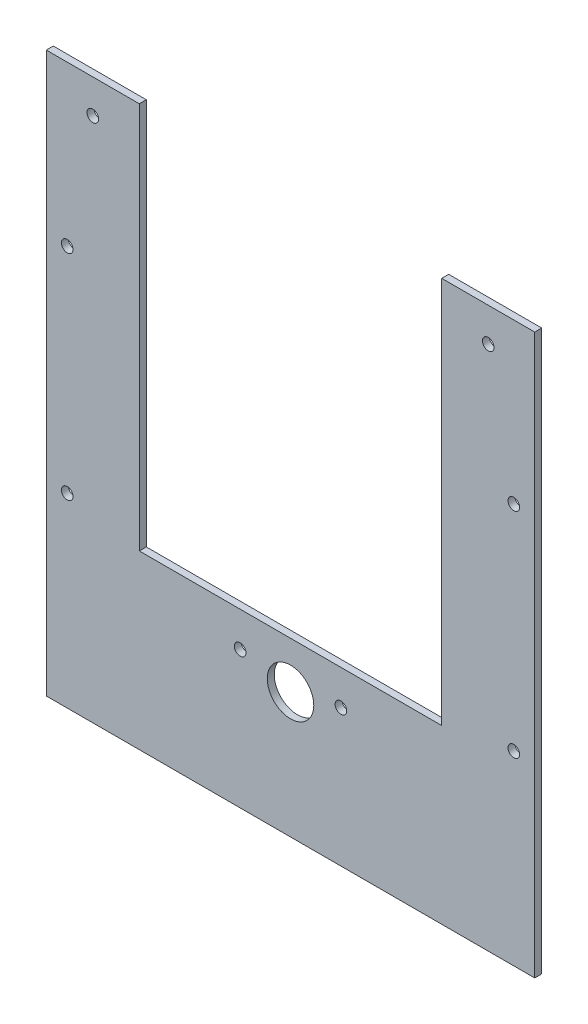
ISO-10303-21;
HEADER;
FILE_DESCRIPTION(('STEP AP214'),'2;1');
FILE_NAME('part.step','',(''),(''),'','','');
FILE_SCHEMA(('AUTOMOTIVE_DESIGN { 1 0 10303 214 1 1 1 1 }'));
ENDSEC;
DATA;
#1=APPLICATION_CONTEXT('core data for automotive mechanical design processes');
#2=APPLICATION_PROTOCOL_DEFINITION('international standard','automotive_design',2000,#1);
#3=PRODUCT_CONTEXT('',#1,'mechanical');
#4=PRODUCT('Part','Part','',(#3));
#5=PRODUCT_RELATED_PRODUCT_CATEGORY('part','',(#4));
#6=PRODUCT_DEFINITION_FORMATION('','',#4);
#7=PRODUCT_DEFINITION_CONTEXT('part definition',#1,'design');
#8=PRODUCT_DEFINITION('design','',#6,#7);
#9=PRODUCT_DEFINITION_SHAPE('','',#8);
#10=(LENGTH_UNIT() NAMED_UNIT(*) SI_UNIT(.MILLI.,.METRE.));
#11=(NAMED_UNIT(*) PLANE_ANGLE_UNIT() SI_UNIT($,.RADIAN.));
#12=(NAMED_UNIT(*) SI_UNIT($,.STERADIAN.) SOLID_ANGLE_UNIT());
#13=UNCERTAINTY_MEASURE_WITH_UNIT(LENGTH_MEASURE(1.E-05),#10,'distance_accuracy_value','');
#14=(GEOMETRIC_REPRESENTATION_CONTEXT(3) GLOBAL_UNCERTAINTY_ASSIGNED_CONTEXT((#13)) GLOBAL_UNIT_ASSIGNED_CONTEXT((#10,
#11,#12)) REPRESENTATION_CONTEXT('',''));
#15=CARTESIAN_POINT('',(0.,0.,0.));
#16=DIRECTION('',(0.,0.,1.));
#17=DIRECTION('',(1.,0.,0.));
#18=AXIS2_PLACEMENT_3D('',#15,#16,#17);
#19=CARTESIAN_POINT('',(0.,0.,3.));
#20=DIRECTION('',(0.,0.,1.));
#21=DIRECTION('',(1.,0.,0.));
#22=AXIS2_PLACEMENT_3D('',#19,#20,#21);
#23=PLANE('',#22);
#24=CARTESIAN_POINT('',(7.16828157057534,762.628389677579,3.));
#25=DIRECTION('',(0.,0.,1.));
#26=DIRECTION('',(1.,0.,0.));
#27=AXIS2_PLACEMENT_3D('',#24,#25,#26);
#28=CIRCLE('',#27,2.5);
#29=CARTESIAN_POINT('',(9.66828157057534,762.628389677579,3.));
#30=VERTEX_POINT('',#29);
#31=EDGE_CURVE('E218',#30,#30,#28,.T.);
#32=ORIENTED_EDGE('',*,*,#31,.F.);
#33=EDGE_LOOP('',(#32));
#34=FACE_BOUND('',#33,.T.);
#35=CARTESIAN_POINT('',(-110.498385096091,875.618389677579,3.));
#36=DIRECTION('',(0.,0.,1.));
#37=DIRECTION('',(1.,0.,0.));
#38=AXIS2_PLACEMENT_3D('',#35,#36,#37);
#39=CIRCLE('',#38,2.5);
#40=CARTESIAN_POINT('',(-107.998385096091,875.618389677579,3.));
#41=VERTEX_POINT('',#40);
#42=EDGE_CURVE('E206',#41,#41,#39,.T.);
#43=ORIENTED_EDGE('',*,*,#42,.F.);
#44=EDGE_LOOP('',(#43));
#45=FACE_BOUND('',#44,.T.);
#46=CARTESIAN_POINT('',(-36.165051762758,762.628389677579,3.));
#47=DIRECTION('',(0.,0.,1.));
#48=DIRECTION('',(1.,0.,0.));
#49=AXIS2_PLACEMENT_3D('',#46,#47,#48);
#50=CIRCLE('',#49,2.5);
#51=CARTESIAN_POINT('',(-33.665051762758,762.628389677579,3.));
#52=VERTEX_POINT('',#51);
#53=EDGE_CURVE('E194',#52,#52,#50,.T.);
#54=ORIENTED_EDGE('',*,*,#53,.F.);
#55=EDGE_LOOP('',(#54));
#56=FACE_BOUND('',#55,.T.);
#57=CARTESIAN_POINT('',(81.5016149039087,875.618389677579,3.));
#58=DIRECTION('',(0.,0.,1.));
#59=DIRECTION('',(1.,0.,0.));
#60=AXIS2_PLACEMENT_3D('',#57,#58,#59);
#61=CIRCLE('',#60,2.50000000000004);
#62=CARTESIAN_POINT('',(84.0016149039087,875.618389677579,3.));
#63=VERTEX_POINT('',#62);
#64=EDGE_CURVE('E182',#63,#63,#61,.T.);
#65=ORIENTED_EDGE('',*,*,#64,.F.);
#66=EDGE_LOOP('',(#65));
#67=FACE_BOUND('',#66,.T.);
#68=DIRECTION('',(0.,1.,0.));
#69=VECTOR('',#68,1.);
#70=CARTESIAN_POINT('',(90.5016149039087,703.628389677579,3.));
#71=LINE('',#70,#69);
#72=CARTESIAN_POINT('',(90.5016149039087,703.628389677579,3.));
#73=VERTEX_POINT('',#72);
#74=CARTESIAN_POINT('',(90.5016149039087,944.128389677579,3.));
#75=VERTEX_POINT('',#74);
#76=EDGE_CURVE('E145',#73,#75,#71,.T.);
#77=ORIENTED_EDGE('',*,*,#76,.T.);
#78=DIRECTION('',(-1.,0.,0.));
#79=VECTOR('',#78,1.);
#80=CARTESIAN_POINT('',(90.5016149039087,944.128389677579,3.));
#81=LINE('',#80,#79);
#82=CARTESIAN_POINT('',(50.5016149039087,944.128389677579,3.));
#83=VERTEX_POINT('',#82);
#84=EDGE_CURVE('E93',#75,#83,#81,.T.);
#85=ORIENTED_EDGE('',*,*,#84,.T.);
#86=DIRECTION('',(0.,-1.,0.));
#87=VECTOR('',#86,1.);
#88=CARTESIAN_POINT('',(50.5016149039087,777.628389677579,3.));
#89=LINE('',#88,#87);
#90=CARTESIAN_POINT('',(50.5016149039087,777.628389677579,3.));
#91=VERTEX_POINT('',#90);
#92=EDGE_CURVE('E160',#83,#91,#89,.T.);
#93=ORIENTED_EDGE('',*,*,#92,.T.);
#94=DIRECTION('',(-1.,0.,0.));
#95=VECTOR('',#94,1.);
#96=CARTESIAN_POINT('',(-79.4983850960913,777.628389677579,3.));
#97=LINE('',#96,#95);
#98=CARTESIAN_POINT('',(-79.4983850960913,777.628389677579,3.));
#99=VERTEX_POINT('',#98);
#100=EDGE_CURVE('E173',#91,#99,#97,.T.);
#101=ORIENTED_EDGE('',*,*,#100,.T.);
#102=DIRECTION('',(0.,1.,0.));
#103=VECTOR('',#102,1.);
#104=CARTESIAN_POINT('',(-79.4983850960913,944.128389677579,3.));
#105=LINE('',#104,#103);
#106=CARTESIAN_POINT('',(-79.4983850960913,944.128389677579,3.));
#107=VERTEX_POINT('',#106);
#108=EDGE_CURVE('E112',#99,#107,#105,.T.);
#109=ORIENTED_EDGE('',*,*,#108,.T.);
#110=DIRECTION('',(-1.,0.,0.));
#111=VECTOR('',#110,1.);
#112=CARTESIAN_POINT('',(-79.4983850960913,944.128389677579,3.));
#113=LINE('',#112,#111);
#114=CARTESIAN_POINT('',(-119.498385096091,944.128389677579,3.));
#115=VERTEX_POINT('',#114);
#116=EDGE_CURVE('E106',#107,#115,#113,.T.);
#117=ORIENTED_EDGE('',*,*,#116,.T.);
#118=DIRECTION('',(0.,-1.,0.));
#119=VECTOR('',#118,1.);
#120=CARTESIAN_POINT('',(-119.498385096091,703.628389677579,3.));
#121=LINE('',#120,#119);
#122=CARTESIAN_POINT('',(-119.498385096091,703.628389677579,3.));
#123=VERTEX_POINT('',#122);
#124=EDGE_CURVE('E110',#115,#123,#121,.T.);
#125=ORIENTED_EDGE('',*,*,#124,.T.);
#126=DIRECTION('',(1.,0.,0.));
#127=VECTOR('',#126,1.);
#128=CARTESIAN_POINT('',(90.5016149039087,703.628389677579,3.));
#129=LINE('',#128,#127);
#130=EDGE_CURVE('E50',#123,#73,#129,.T.);
#131=ORIENTED_EDGE('',*,*,#130,.T.);
#132=EDGE_LOOP('',(#77,#85,#93,#101,#109,#117,#125,#131));
#133=FACE_BOUND('',#132,.T.);
#134=CARTESIAN_POINT('',(70.5016149039087,929.628389677579,3.));
#135=DIRECTION('',(0.,0.,1.));
#136=DIRECTION('',(1.,0.,0.));
#137=AXIS2_PLACEMENT_3D('',#134,#135,#136);
#138=CIRCLE('',#137,2.50000000000002);
#139=CARTESIAN_POINT('',(73.0016149039087,929.628389677579,3.));
#140=VERTEX_POINT('',#139);
#141=EDGE_CURVE('E134',#140,#140,#138,.T.);
#142=ORIENTED_EDGE('',*,*,#141,.F.);
#143=EDGE_LOOP('',(#142));
#144=FACE_BOUND('',#143,.T.);
#145=CARTESIAN_POINT('',(81.5016149039087,783.618389677579,3.));
#146=DIRECTION('',(0.,0.,1.));
#147=DIRECTION('',(1.,0.,0.));
#148=AXIS2_PLACEMENT_3D('',#145,#146,#147);
#149=CIRCLE('',#148,2.49999999999997);
#150=CARTESIAN_POINT('',(84.0016149039087,783.618389677579,3.));
#151=VERTEX_POINT('',#150);
#152=EDGE_CURVE('E188',#151,#151,#149,.T.);
#153=ORIENTED_EDGE('',*,*,#152,.F.);
#154=EDGE_LOOP('',(#153));
#155=FACE_BOUND('',#154,.T.);
#156=CARTESIAN_POINT('',(-110.498385096091,783.618389677579,3.));
#157=DIRECTION('',(0.,0.,1.));
#158=DIRECTION('',(1.,0.,0.));
#159=AXIS2_PLACEMENT_3D('',#156,#157,#158);
#160=CIRCLE('',#159,2.5);
#161=CARTESIAN_POINT('',(-107.998385096091,783.618389677579,3.));
#162=VERTEX_POINT('',#161);
#163=EDGE_CURVE('E200',#162,#162,#160,.T.);
#164=ORIENTED_EDGE('',*,*,#163,.F.);
#165=EDGE_LOOP('',(#164));
#166=FACE_BOUND('',#165,.T.);
#167=CARTESIAN_POINT('',(-99.4983850960913,929.628389677579,3.));
#168=DIRECTION('',(0.,0.,1.));
#169=DIRECTION('',(1.,0.,0.));
#170=AXIS2_PLACEMENT_3D('',#167,#168,#169);
#171=CIRCLE('',#170,2.50000000000001);
#172=CARTESIAN_POINT('',(-96.9983850960913,929.628389677579,3.));
#173=VERTEX_POINT('',#172);
#174=EDGE_CURVE('E212',#173,#173,#171,.T.);
#175=ORIENTED_EDGE('',*,*,#174,.F.);
#176=EDGE_LOOP('',(#175));
#177=FACE_BOUND('',#176,.T.);
#178=CARTESIAN_POINT('',(-14.4983850960913,757.628389677579,3.));
#179=DIRECTION('',(0.,0.,1.));
#180=DIRECTION('',(1.,0.,0.));
#181=AXIS2_PLACEMENT_3D('',#178,#179,#180);
#182=CIRCLE('',#181,10.);
#183=CARTESIAN_POINT('',(-4.49838509609131,757.628389677579,3.));
#184=VERTEX_POINT('',#183);
#185=EDGE_CURVE('E224',#184,#184,#182,.T.);
#186=ORIENTED_EDGE('',*,*,#185,.F.);
#187=EDGE_LOOP('',(#186));
#188=FACE_BOUND('',#187,.T.);
#189=ADVANCED_FACE('F33',(#34,#45,#56,#67,#133,#144,#155,#166,#177,#188),#23,.T.);
#190=CARTESIAN_POINT('',(0.,0.,0.));
#191=DIRECTION('',(0.,0.,1.));
#192=DIRECTION('',(1.,0.,0.));
#193=AXIS2_PLACEMENT_3D('',#190,#191,#192);
#194=PLANE('',#193);
#195=DIRECTION('',(0.,1.,0.));
#196=VECTOR('',#195,1.);
#197=CARTESIAN_POINT('',(90.5016149039087,703.628389677579,0.));
#198=LINE('',#197,#196);
#199=CARTESIAN_POINT('',(90.5016149039087,703.628389677579,0.));
#200=VERTEX_POINT('',#199);
#201=CARTESIAN_POINT('',(90.5016149039087,944.128389677579,0.));
#202=VERTEX_POINT('',#201);
#203=EDGE_CURVE('E130',#200,#202,#198,.T.);
#204=ORIENTED_EDGE('',*,*,#203,.F.);
#205=DIRECTION('',(1.,0.,0.));
#206=VECTOR('',#205,1.);
#207=CARTESIAN_POINT('',(90.5016149039087,703.628389677579,0.));
#208=LINE('',#207,#206);
#209=CARTESIAN_POINT('',(-119.498385096091,703.628389677579,0.));
#210=VERTEX_POINT('',#209);
#211=EDGE_CURVE('E85',#210,#200,#208,.T.);
#212=ORIENTED_EDGE('',*,*,#211,.F.);
#213=DIRECTION('',(0.,-1.,0.));
#214=VECTOR('',#213,1.);
#215=CARTESIAN_POINT('',(-119.498385096091,703.628389677579,0.));
#216=LINE('',#215,#214);
#217=CARTESIAN_POINT('',(-119.498385096091,944.128389677579,0.));
#218=VERTEX_POINT('',#217);
#219=EDGE_CURVE('E79',#218,#210,#216,.T.);
#220=ORIENTED_EDGE('',*,*,#219,.F.);
#221=DIRECTION('',(-1.,0.,0.));
#222=VECTOR('',#221,1.);
#223=CARTESIAN_POINT('',(-79.4983850960913,944.128389677579,0.));
#224=LINE('',#223,#222);
#225=CARTESIAN_POINT('',(-79.4983850960913,944.128389677579,0.));
#226=VERTEX_POINT('',#225);
#227=EDGE_CURVE('E120',#226,#218,#224,.T.);
#228=ORIENTED_EDGE('',*,*,#227,.F.);
#229=DIRECTION('',(0.,1.,0.));
#230=VECTOR('',#229,1.);
#231=CARTESIAN_POINT('',(-79.4983850960913,944.128389677579,0.));
#232=LINE('',#231,#230);
#233=CARTESIAN_POINT('',(-79.4983850960913,777.628389677579,0.));
#234=VERTEX_POINT('',#233);
#235=EDGE_CURVE('E140',#234,#226,#232,.T.);
#236=ORIENTED_EDGE('',*,*,#235,.F.);
#237=DIRECTION('',(-1.,0.,0.));
#238=VECTOR('',#237,1.);
#239=CARTESIAN_POINT('',(-79.4983850960913,777.628389677579,0.));
#240=LINE('',#239,#238);
#241=CARTESIAN_POINT('',(50.5016149039087,777.628389677579,0.));
#242=VERTEX_POINT('',#241);
#243=EDGE_CURVE('E138',#242,#234,#240,.T.);
#244=ORIENTED_EDGE('',*,*,#243,.F.);
#245=DIRECTION('',(0.,-1.,0.));
#246=VECTOR('',#245,1.);
#247=CARTESIAN_POINT('',(50.5016149039087,777.628389677579,0.));
#248=LINE('',#247,#246);
#249=CARTESIAN_POINT('',(50.5016149039087,944.128389677579,0.));
#250=VERTEX_POINT('',#249);
#251=EDGE_CURVE('E136',#250,#242,#248,.T.);
#252=ORIENTED_EDGE('',*,*,#251,.F.);
#253=DIRECTION('',(-1.,0.,0.));
#254=VECTOR('',#253,1.);
#255=CARTESIAN_POINT('',(90.5016149039087,944.128389677579,0.));
#256=LINE('',#255,#254);
#257=EDGE_CURVE('E133',#202,#250,#256,.T.);
#258=ORIENTED_EDGE('',*,*,#257,.F.);
#259=EDGE_LOOP('',(#204,#212,#220,#228,#236,#244,#252,#258));
#260=FACE_BOUND('',#259,.T.);
#261=CARTESIAN_POINT('',(70.5016149039087,929.628389677579,0.));
#262=DIRECTION('',(0.,0.,1.));
#263=DIRECTION('',(1.,0.,0.));
#264=AXIS2_PLACEMENT_3D('',#261,#262,#263);
#265=CIRCLE('',#264,2.50000000000002);
#266=CARTESIAN_POINT('',(73.0016149039087,929.628389677579,0.));
#267=VERTEX_POINT('',#266);
#268=EDGE_CURVE('E179',#267,#267,#265,.T.);
#269=ORIENTED_EDGE('',*,*,#268,.T.);
#270=EDGE_LOOP('',(#269));
#271=FACE_BOUND('',#270,.T.);
#272=CARTESIAN_POINT('',(81.5016149039087,875.618389677579,0.));
#273=DIRECTION('',(0.,0.,1.));
#274=DIRECTION('',(1.,0.,0.));
#275=AXIS2_PLACEMENT_3D('',#272,#273,#274);
#276=CIRCLE('',#275,2.50000000000004);
#277=CARTESIAN_POINT('',(84.0016149039087,875.618389677579,0.));
#278=VERTEX_POINT('',#277);
#279=EDGE_CURVE('E185',#278,#278,#276,.T.);
#280=ORIENTED_EDGE('',*,*,#279,.T.);
#281=EDGE_LOOP('',(#280));
#282=FACE_BOUND('',#281,.T.);
#283=CARTESIAN_POINT('',(81.5016149039087,783.618389677579,0.));
#284=DIRECTION('',(0.,0.,1.));
#285=DIRECTION('',(1.,0.,0.));
#286=AXIS2_PLACEMENT_3D('',#283,#284,#285);
#287=CIRCLE('',#286,2.49999999999997);
#288=CARTESIAN_POINT('',(84.0016149039087,783.618389677579,0.));
#289=VERTEX_POINT('',#288);
#290=EDGE_CURVE('E191',#289,#289,#287,.T.);
#291=ORIENTED_EDGE('',*,*,#290,.T.);
#292=EDGE_LOOP('',(#291));
#293=FACE_BOUND('',#292,.T.);
#294=CARTESIAN_POINT('',(-36.165051762758,762.628389677579,0.));
#295=DIRECTION('',(0.,0.,1.));
#296=DIRECTION('',(1.,0.,0.));
#297=AXIS2_PLACEMENT_3D('',#294,#295,#296);
#298=CIRCLE('',#297,2.5);
#299=CARTESIAN_POINT('',(-33.665051762758,762.628389677579,0.));
#300=VERTEX_POINT('',#299);
#301=EDGE_CURVE('E197',#300,#300,#298,.T.);
#302=ORIENTED_EDGE('',*,*,#301,.T.);
#303=EDGE_LOOP('',(#302));
#304=FACE_BOUND('',#303,.T.);
#305=CARTESIAN_POINT('',(-110.498385096091,783.618389677579,0.));
#306=DIRECTION('',(0.,0.,1.));
#307=DIRECTION('',(1.,0.,0.));
#308=AXIS2_PLACEMENT_3D('',#305,#306,#307);
#309=CIRCLE('',#308,2.5);
#310=CARTESIAN_POINT('',(-107.998385096091,783.618389677579,0.));
#311=VERTEX_POINT('',#310);
#312=EDGE_CURVE('E203',#311,#311,#309,.T.);
#313=ORIENTED_EDGE('',*,*,#312,.T.);
#314=EDGE_LOOP('',(#313));
#315=FACE_BOUND('',#314,.T.);
#316=CARTESIAN_POINT('',(-110.498385096091,875.618389677579,0.));
#317=DIRECTION('',(0.,0.,1.));
#318=DIRECTION('',(1.,0.,0.));
#319=AXIS2_PLACEMENT_3D('',#316,#317,#318);
#320=CIRCLE('',#319,2.5);
#321=CARTESIAN_POINT('',(-107.998385096091,875.618389677579,0.));
#322=VERTEX_POINT('',#321);
#323=EDGE_CURVE('E209',#322,#322,#320,.T.);
#324=ORIENTED_EDGE('',*,*,#323,.T.);
#325=EDGE_LOOP('',(#324));
#326=FACE_BOUND('',#325,.T.);
#327=CARTESIAN_POINT('',(-99.4983850960913,929.628389677579,0.));
#328=DIRECTION('',(0.,0.,1.));
#329=DIRECTION('',(1.,0.,0.));
#330=AXIS2_PLACEMENT_3D('',#327,#328,#329);
#331=CIRCLE('',#330,2.50000000000001);
#332=CARTESIAN_POINT('',(-96.9983850960913,929.628389677579,0.));
#333=VERTEX_POINT('',#332);
#334=EDGE_CURVE('E215',#333,#333,#331,.T.);
#335=ORIENTED_EDGE('',*,*,#334,.T.);
#336=EDGE_LOOP('',(#335));
#337=FACE_BOUND('',#336,.T.);
#338=CARTESIAN_POINT('',(7.16828157057534,762.628389677579,0.));
#339=DIRECTION('',(0.,0.,1.));
#340=DIRECTION('',(1.,0.,0.));
#341=AXIS2_PLACEMENT_3D('',#338,#339,#340);
#342=CIRCLE('',#341,2.5);
#343=CARTESIAN_POINT('',(9.66828157057534,762.628389677579,0.));
#344=VERTEX_POINT('',#343);
#345=EDGE_CURVE('E221',#344,#344,#342,.T.);
#346=ORIENTED_EDGE('',*,*,#345,.T.);
#347=EDGE_LOOP('',(#346));
#348=FACE_BOUND('',#347,.T.);
#349=CARTESIAN_POINT('',(-14.4983850960913,757.628389677579,0.));
#350=DIRECTION('',(0.,0.,1.));
#351=DIRECTION('',(1.,0.,0.));
#352=AXIS2_PLACEMENT_3D('',#349,#350,#351);
#353=CIRCLE('',#352,10.);
#354=CARTESIAN_POINT('',(-4.49838509609131,757.628389677579,0.));
#355=VERTEX_POINT('',#354);
#356=EDGE_CURVE('E227',#355,#355,#353,.T.);
#357=ORIENTED_EDGE('',*,*,#356,.T.);
#358=EDGE_LOOP('',(#357));
#359=FACE_BOUND('',#358,.T.);
#360=ADVANCED_FACE('F164',(#260,#271,#282,#293,#304,#315,#326,#337,#348,#359),#194,.F.);
#361=CARTESIAN_POINT('',(90.5016149039087,703.628389677579,3.));
#362=DIRECTION('',(-1.,0.,0.));
#363=DIRECTION('',(0.,0.,1.));
#364=AXIS2_PLACEMENT_3D('',#361,#362,#363);
#365=PLANE('',#364);
#366=ORIENTED_EDGE('',*,*,#203,.T.);
#367=DIRECTION('',(0.,0.,-1.));
#368=VECTOR('',#367,1.);
#369=CARTESIAN_POINT('',(90.5016149039087,944.128389677579,3.));
#370=LINE('',#369,#368);
#371=EDGE_CURVE('E11',#75,#202,#370,.T.);
#372=ORIENTED_EDGE('',*,*,#371,.F.);
#373=ORIENTED_EDGE('',*,*,#76,.F.);
#374=DIRECTION('',(0.,0.,-1.));
#375=VECTOR('',#374,1.);
#376=CARTESIAN_POINT('',(90.5016149039087,703.628389677579,3.));
#377=LINE('',#376,#375);
#378=EDGE_CURVE('E126',#73,#200,#377,.T.);
#379=ORIENTED_EDGE('',*,*,#378,.T.);
#380=EDGE_LOOP('',(#366,#372,#373,#379));
#381=FACE_BOUND('',#380,.T.);
#382=ADVANCED_FACE('F35',(#381),#365,.F.);
#383=CARTESIAN_POINT('',(90.5016149039087,944.128389677579,3.));
#384=DIRECTION('',(0.,-1.,0.));
#385=DIRECTION('',(0.,0.,-1.));
#386=AXIS2_PLACEMENT_3D('',#383,#384,#385);
#387=PLANE('',#386);
#388=ORIENTED_EDGE('',*,*,#257,.T.);
#389=DIRECTION('',(0.,0.,-1.));
#390=VECTOR('',#389,1.);
#391=CARTESIAN_POINT('',(50.5016149039087,944.128389677579,3.));
#392=LINE('',#391,#390);
#393=EDGE_CURVE('E42',#83,#250,#392,.T.);
#394=ORIENTED_EDGE('',*,*,#393,.F.);
#395=ORIENTED_EDGE('',*,*,#84,.F.);
#396=ORIENTED_EDGE('',*,*,#371,.T.);
#397=EDGE_LOOP('',(#388,#394,#395,#396));
#398=FACE_BOUND('',#397,.T.);
#399=ADVANCED_FACE('F261',(#398),#387,.F.);
#400=CARTESIAN_POINT('',(50.5016149039087,777.628389677579,3.));
#401=DIRECTION('',(1.,0.,0.));
#402=DIRECTION('',(0.,1.,0.));
#403=AXIS2_PLACEMENT_3D('',#400,#401,#402);
#404=PLANE('',#403);
#405=ORIENTED_EDGE('',*,*,#251,.T.);
#406=DIRECTION('',(0.,0.,-1.));
#407=VECTOR('',#406,1.);
#408=CARTESIAN_POINT('',(50.5016149039087,777.628389677579,3.));
#409=LINE('',#408,#407);
#410=EDGE_CURVE('E152',#91,#242,#409,.T.);
#411=ORIENTED_EDGE('',*,*,#410,.F.);
#412=ORIENTED_EDGE('',*,*,#92,.F.);
#413=ORIENTED_EDGE('',*,*,#393,.T.);
#414=EDGE_LOOP('',(#405,#411,#412,#413));
#415=FACE_BOUND('',#414,.T.);
#416=ADVANCED_FACE('F158',(#415),#404,.F.);
#417=CARTESIAN_POINT('',(-79.4983850960913,777.628389677579,3.));
#418=DIRECTION('',(0.,-1.,0.));
#419=DIRECTION('',(0.,0.,-1.));
#420=AXIS2_PLACEMENT_3D('',#417,#418,#419);
#421=PLANE('',#420);
#422=ORIENTED_EDGE('',*,*,#243,.T.);
#423=DIRECTION('',(0.,0.,-1.));
#424=VECTOR('',#423,1.);
#425=CARTESIAN_POINT('',(-79.4983850960913,777.628389677579,3.));
#426=LINE('',#425,#424);
#427=EDGE_CURVE('E149',#99,#234,#426,.T.);
#428=ORIENTED_EDGE('',*,*,#427,.F.);
#429=ORIENTED_EDGE('',*,*,#100,.F.);
#430=ORIENTED_EDGE('',*,*,#410,.T.);
#431=EDGE_LOOP('',(#422,#428,#429,#430));
#432=FACE_BOUND('',#431,.T.);
#433=ADVANCED_FACE('F169',(#432),#421,.F.);
#434=CARTESIAN_POINT('',(-79.4983850960913,944.128389677579,3.));
#435=DIRECTION('',(-1.,0.,0.));
#436=DIRECTION('',(0.,0.,1.));
#437=AXIS2_PLACEMENT_3D('',#434,#435,#436);
#438=PLANE('',#437);
#439=ORIENTED_EDGE('',*,*,#235,.T.);
#440=DIRECTION('',(0.,0.,-1.));
#441=VECTOR('',#440,1.);
#442=CARTESIAN_POINT('',(-79.4983850960913,944.128389677579,3.));
#443=LINE('',#442,#441);
#444=EDGE_CURVE('E121',#107,#226,#443,.T.);
#445=ORIENTED_EDGE('',*,*,#444,.F.);
#446=ORIENTED_EDGE('',*,*,#108,.F.);
#447=ORIENTED_EDGE('',*,*,#427,.T.);
#448=EDGE_LOOP('',(#439,#445,#446,#447));
#449=FACE_BOUND('',#448,.T.);
#450=ADVANCED_FACE('F172',(#449),#438,.F.);
#451=CARTESIAN_POINT('',(-79.4983850960913,944.128389677579,3.));
#452=DIRECTION('',(0.,-1.,0.));
#453=DIRECTION('',(0.,0.,-1.));
#454=AXIS2_PLACEMENT_3D('',#451,#452,#453);
#455=PLANE('',#454);
#456=ORIENTED_EDGE('',*,*,#227,.T.);
#457=DIRECTION('',(0.,0.,-1.));
#458=VECTOR('',#457,1.);
#459=CARTESIAN_POINT('',(-119.498385096091,944.128389677579,3.));
#460=LINE('',#459,#458);
#461=EDGE_CURVE('E117',#115,#218,#460,.T.);
#462=ORIENTED_EDGE('',*,*,#461,.F.);
#463=ORIENTED_EDGE('',*,*,#116,.F.);
#464=ORIENTED_EDGE('',*,*,#444,.T.);
#465=EDGE_LOOP('',(#456,#462,#463,#464));
#466=FACE_BOUND('',#465,.T.);
#467=ADVANCED_FACE('F118',(#466),#455,.F.);
#468=CARTESIAN_POINT('',(-119.498385096091,703.628389677579,3.));
#469=DIRECTION('',(1.,0.,0.));
#470=DIRECTION('',(0.,0.,-1.));
#471=AXIS2_PLACEMENT_3D('',#468,#469,#470);
#472=PLANE('',#471);
#473=ORIENTED_EDGE('',*,*,#219,.T.);
#474=DIRECTION('',(0.,0.,-1.));
#475=VECTOR('',#474,1.);
#476=CARTESIAN_POINT('',(-119.498385096091,703.628389677579,3.));
#477=LINE('',#476,#475);
#478=EDGE_CURVE('E122',#123,#210,#477,.T.);
#479=ORIENTED_EDGE('',*,*,#478,.F.);
#480=ORIENTED_EDGE('',*,*,#124,.F.);
#481=ORIENTED_EDGE('',*,*,#461,.T.);
#482=EDGE_LOOP('',(#473,#479,#480,#481));
#483=FACE_BOUND('',#482,.T.);
#484=ADVANCED_FACE('F124',(#483),#472,.F.);
#485=CARTESIAN_POINT('',(90.5016149039087,703.628389677579,3.));
#486=DIRECTION('',(0.,1.,0.));
#487=DIRECTION('',(0.,0.,1.));
#488=AXIS2_PLACEMENT_3D('',#485,#486,#487);
#489=PLANE('',#488);
#490=ORIENTED_EDGE('',*,*,#211,.T.);
#491=ORIENTED_EDGE('',*,*,#378,.F.);
#492=ORIENTED_EDGE('',*,*,#130,.F.);
#493=ORIENTED_EDGE('',*,*,#478,.T.);
#494=EDGE_LOOP('',(#490,#491,#492,#493));
#495=FACE_BOUND('',#494,.T.);
#496=ADVANCED_FACE('F249',(#495),#489,.F.);
#497=CARTESIAN_POINT('',(70.5016149039087,929.628389677579,3.));
#498=DIRECTION('',(0.,0.,-1.));
#499=DIRECTION('',(-1.,0.,0.));
#500=AXIS2_PLACEMENT_3D('',#497,#498,#499);
#501=CYLINDRICAL_SURFACE('',#500,2.50000000000002);
#502=ORIENTED_EDGE('',*,*,#141,.T.);
#503=EDGE_LOOP('',(#502));
#504=FACE_BOUND('',#503,.T.);
#505=ORIENTED_EDGE('',*,*,#268,.F.);
#506=EDGE_LOOP('',(#505));
#507=FACE_BOUND('',#506,.T.);
#508=ADVANCED_FACE('F246',(#504,#507),#501,.F.);
#509=CARTESIAN_POINT('',(81.5016149039087,875.618389677579,3.));
#510=DIRECTION('',(0.,0.,-1.));
#511=DIRECTION('',(-1.,0.,0.));
#512=AXIS2_PLACEMENT_3D('',#509,#510,#511);
#513=CYLINDRICAL_SURFACE('',#512,2.50000000000004);
#514=ORIENTED_EDGE('',*,*,#64,.T.);
#515=EDGE_LOOP('',(#514));
#516=FACE_BOUND('',#515,.T.);
#517=ORIENTED_EDGE('',*,*,#279,.F.);
#518=EDGE_LOOP('',(#517));
#519=FACE_BOUND('',#518,.T.);
#520=ADVANCED_FACE('F325',(#516,#519),#513,.F.);
#521=CARTESIAN_POINT('',(81.5016149039087,783.618389677579,3.));
#522=DIRECTION('',(0.,0.,-1.));
#523=DIRECTION('',(-1.,0.,0.));
#524=AXIS2_PLACEMENT_3D('',#521,#522,#523);
#525=CYLINDRICAL_SURFACE('',#524,2.49999999999997);
#526=ORIENTED_EDGE('',*,*,#152,.T.);
#527=EDGE_LOOP('',(#526));
#528=FACE_BOUND('',#527,.T.);
#529=ORIENTED_EDGE('',*,*,#290,.F.);
#530=EDGE_LOOP('',(#529));
#531=FACE_BOUND('',#530,.T.);
#532=ADVANCED_FACE('F333',(#528,#531),#525,.F.);
#533=CARTESIAN_POINT('',(-36.165051762758,762.628389677579,3.));
#534=DIRECTION('',(0.,0.,-1.));
#535=DIRECTION('',(-1.,0.,0.));
#536=AXIS2_PLACEMENT_3D('',#533,#534,#535);
#537=CYLINDRICAL_SURFACE('',#536,2.5);
#538=ORIENTED_EDGE('',*,*,#53,.T.);
#539=EDGE_LOOP('',(#538));
#540=FACE_BOUND('',#539,.T.);
#541=ORIENTED_EDGE('',*,*,#301,.F.);
#542=EDGE_LOOP('',(#541));
#543=FACE_BOUND('',#542,.T.);
#544=ADVANCED_FACE('F341',(#540,#543),#537,.F.);
#545=CARTESIAN_POINT('',(-110.498385096091,783.618389677579,3.));
#546=DIRECTION('',(0.,0.,-1.));
#547=DIRECTION('',(-1.,0.,0.));
#548=AXIS2_PLACEMENT_3D('',#545,#546,#547);
#549=CYLINDRICAL_SURFACE('',#548,2.5);
#550=ORIENTED_EDGE('',*,*,#163,.T.);
#551=EDGE_LOOP('',(#550));
#552=FACE_BOUND('',#551,.T.);
#553=ORIENTED_EDGE('',*,*,#312,.F.);
#554=EDGE_LOOP('',(#553));
#555=FACE_BOUND('',#554,.T.);
#556=ADVANCED_FACE('F350',(#552,#555),#549,.F.);
#557=CARTESIAN_POINT('',(-110.498385096091,875.618389677579,3.));
#558=DIRECTION('',(0.,0.,-1.));
#559=DIRECTION('',(-1.,0.,0.));
#560=AXIS2_PLACEMENT_3D('',#557,#558,#559);
#561=CYLINDRICAL_SURFACE('',#560,2.5);
#562=ORIENTED_EDGE('',*,*,#42,.T.);
#563=EDGE_LOOP('',(#562));
#564=FACE_BOUND('',#563,.T.);
#565=ORIENTED_EDGE('',*,*,#323,.F.);
#566=EDGE_LOOP('',(#565));
#567=FACE_BOUND('',#566,.T.);
#568=ADVANCED_FACE('F359',(#564,#567),#561,.F.);
#569=CARTESIAN_POINT('',(-99.4983850960913,929.628389677579,3.));
#570=DIRECTION('',(0.,0.,-1.));
#571=DIRECTION('',(-1.,0.,0.));
#572=AXIS2_PLACEMENT_3D('',#569,#570,#571);
#573=CYLINDRICAL_SURFACE('',#572,2.50000000000001);
#574=ORIENTED_EDGE('',*,*,#174,.T.);
#575=EDGE_LOOP('',(#574));
#576=FACE_BOUND('',#575,.T.);
#577=ORIENTED_EDGE('',*,*,#334,.F.);
#578=EDGE_LOOP('',(#577));
#579=FACE_BOUND('',#578,.T.);
#580=ADVANCED_FACE('F368',(#576,#579),#573,.F.);
#581=CARTESIAN_POINT('',(7.16828157057534,762.628389677579,3.));
#582=DIRECTION('',(0.,0.,-1.));
#583=DIRECTION('',(-1.,0.,0.));
#584=AXIS2_PLACEMENT_3D('',#581,#582,#583);
#585=CYLINDRICAL_SURFACE('',#584,2.5);
#586=ORIENTED_EDGE('',*,*,#31,.T.);
#587=EDGE_LOOP('',(#586));
#588=FACE_BOUND('',#587,.T.);
#589=ORIENTED_EDGE('',*,*,#345,.F.);
#590=EDGE_LOOP('',(#589));
#591=FACE_BOUND('',#590,.T.);
#592=ADVANCED_FACE('F377',(#588,#591),#585,.F.);
#593=CARTESIAN_POINT('',(-14.4983850960913,757.628389677579,3.));
#594=DIRECTION('',(0.,0.,-1.));
#595=DIRECTION('',(-1.,0.,0.));
#596=AXIS2_PLACEMENT_3D('',#593,#594,#595);
#597=CYLINDRICAL_SURFACE('',#596,10.);
#598=ORIENTED_EDGE('',*,*,#185,.T.);
#599=EDGE_LOOP('',(#598));
#600=FACE_BOUND('',#599,.T.);
#601=ORIENTED_EDGE('',*,*,#356,.F.);
#602=EDGE_LOOP('',(#601));
#603=FACE_BOUND('',#602,.T.);
#604=ADVANCED_FACE('F233',(#600,#603),#597,.F.);
#605=CLOSED_SHELL('',(#189,#360,#382,#399,#416,#433,#450,#467,#484,#496,#508,#520,#532,#544,
#556,#568,#580,#592,#604));
#606=MANIFOLD_SOLID_BREP('B2',#605);
#607=ADVANCED_BREP_SHAPE_REPRESENTATION('',(#18,#606),#14);
#608=SHAPE_DEFINITION_REPRESENTATION(#9,#607);
ENDSEC;
END-ISO-10303-21;
